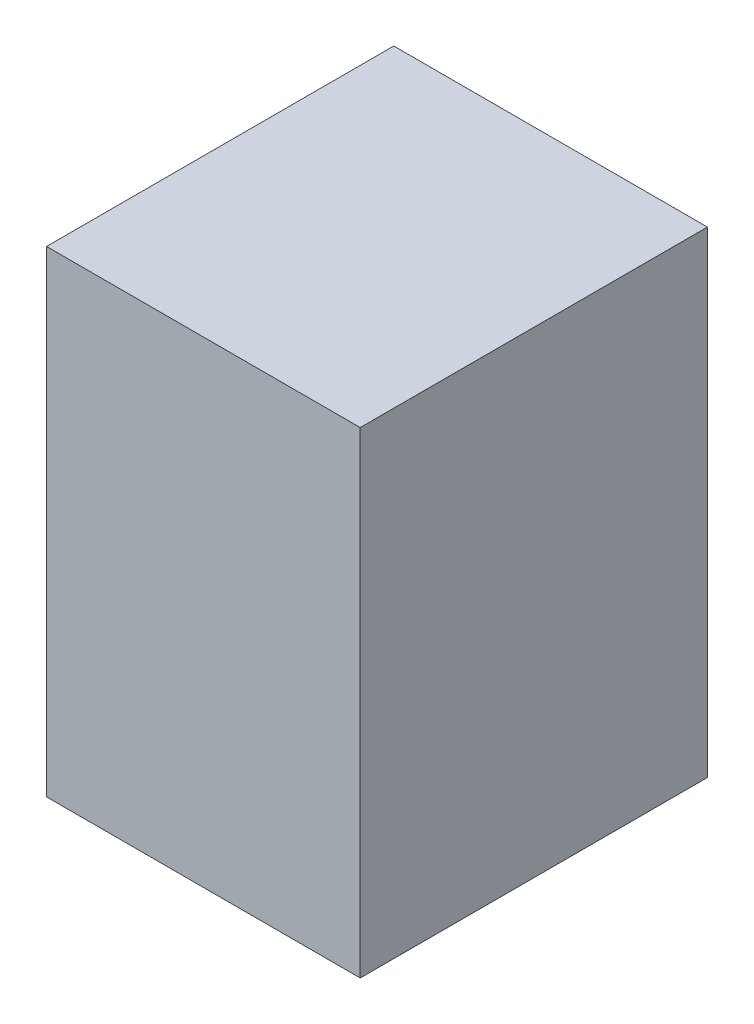
ISO-10303-21;
HEADER;
FILE_DESCRIPTION(('STEP AP214'),'2;1');
FILE_NAME('part.step','',(''),(''),'','','');
FILE_SCHEMA(('AUTOMOTIVE_DESIGN { 1 0 10303 214 1 1 1 1 }'));
ENDSEC;
DATA;
#1=APPLICATION_CONTEXT('core data for automotive mechanical design processes');
#2=APPLICATION_PROTOCOL_DEFINITION('international standard','automotive_design',2000,#1);
#3=PRODUCT_CONTEXT('',#1,'mechanical');
#4=PRODUCT('Part','Part','',(#3));
#5=PRODUCT_RELATED_PRODUCT_CATEGORY('part','',(#4));
#6=PRODUCT_DEFINITION_FORMATION('','',#4);
#7=PRODUCT_DEFINITION_CONTEXT('part definition',#1,'design');
#8=PRODUCT_DEFINITION('design','',#6,#7);
#9=PRODUCT_DEFINITION_SHAPE('','',#8);
#10=(LENGTH_UNIT() NAMED_UNIT(*) SI_UNIT(.MILLI.,.METRE.));
#11=(NAMED_UNIT(*) PLANE_ANGLE_UNIT() SI_UNIT($,.RADIAN.));
#12=(NAMED_UNIT(*) SI_UNIT($,.STERADIAN.) SOLID_ANGLE_UNIT());
#13=UNCERTAINTY_MEASURE_WITH_UNIT(LENGTH_MEASURE(1.E-05),#10,'distance_accuracy_value','');
#14=(GEOMETRIC_REPRESENTATION_CONTEXT(3) GLOBAL_UNCERTAINTY_ASSIGNED_CONTEXT((#13)) GLOBAL_UNIT_ASSIGNED_CONTEXT((#10,
#11,#12)) REPRESENTATION_CONTEXT('',''));
#15=CARTESIAN_POINT('',(0.,0.,0.));
#16=DIRECTION('',(0.,0.,1.));
#17=DIRECTION('',(1.,0.,0.));
#18=AXIS2_PLACEMENT_3D('',#15,#16,#17);
#19=CARTESIAN_POINT('',(20.1,30.55,44.5));
#20=DIRECTION('',(-1.,0.,0.));
#21=DIRECTION('',(0.,-1.,0.));
#22=AXIS2_PLACEMENT_3D('',#19,#20,#21);
#23=PLANE('',#22);
#24=DIRECTION('',(0.,1.,0.));
#25=VECTOR('',#24,1.);
#26=CARTESIAN_POINT('',(20.1,30.55,0.));
#27=LINE('',#26,#25);
#28=CARTESIAN_POINT('',(20.1,-30.55,0.));
#29=VERTEX_POINT('',#28);
#30=CARTESIAN_POINT('',(20.1,30.55,0.));
#31=VERTEX_POINT('',#30);
#32=EDGE_CURVE('E99',#29,#31,#27,.T.);
#33=ORIENTED_EDGE('',*,*,#32,.T.);
#34=DIRECTION('',(0.,0.,-1.));
#35=VECTOR('',#34,1.);
#36=CARTESIAN_POINT('',(20.1,30.55,44.5));
#37=LINE('',#36,#35);
#38=CARTESIAN_POINT('',(20.1,30.55,44.5));
#39=VERTEX_POINT('',#38);
#40=EDGE_CURVE('E11',#39,#31,#37,.T.);
#41=ORIENTED_EDGE('',*,*,#40,.F.);
#42=DIRECTION('',(0.,1.,0.));
#43=VECTOR('',#42,1.);
#44=CARTESIAN_POINT('',(20.1,30.55,44.5));
#45=LINE('',#44,#43);
#46=CARTESIAN_POINT('',(20.1,-30.55,44.5));
#47=VERTEX_POINT('',#46);
#48=EDGE_CURVE('E87',#47,#39,#45,.T.);
#49=ORIENTED_EDGE('',*,*,#48,.F.);
#50=DIRECTION('',(0.,0.,-1.));
#51=VECTOR('',#50,1.);
#52=CARTESIAN_POINT('',(20.1,-30.55,44.5));
#53=LINE('',#52,#51);
#54=EDGE_CURVE('E95',#47,#29,#53,.T.);
#55=ORIENTED_EDGE('',*,*,#54,.T.);
#56=EDGE_LOOP('',(#33,#41,#49,#55));
#57=FACE_BOUND('',#56,.T.);
#58=ADVANCED_FACE('F36',(#57),#23,.F.);
#59=CARTESIAN_POINT('',(-20.1,30.55,44.5));
#60=DIRECTION('',(0.,-1.,0.));
#61=DIRECTION('',(0.,0.,-1.));
#62=AXIS2_PLACEMENT_3D('',#59,#60,#61);
#63=PLANE('',#62);
#64=DIRECTION('',(-1.,0.,0.));
#65=VECTOR('',#64,1.);
#66=CARTESIAN_POINT('',(-20.1,30.55,0.));
#67=LINE('',#66,#65);
#68=CARTESIAN_POINT('',(-20.1,30.55,0.));
#69=VERTEX_POINT('',#68);
#70=EDGE_CURVE('E91',#31,#69,#67,.T.);
#71=ORIENTED_EDGE('',*,*,#70,.T.);
#72=DIRECTION('',(0.,0.,-1.));
#73=VECTOR('',#72,1.);
#74=CARTESIAN_POINT('',(-20.1,30.55,44.5));
#75=LINE('',#74,#73);
#76=CARTESIAN_POINT('',(-20.1,30.55,44.5));
#77=VERTEX_POINT('',#76);
#78=EDGE_CURVE('E44',#77,#69,#75,.T.);
#79=ORIENTED_EDGE('',*,*,#78,.F.);
#80=DIRECTION('',(-1.,0.,0.));
#81=VECTOR('',#80,1.);
#82=CARTESIAN_POINT('',(-20.1,30.55,44.5));
#83=LINE('',#82,#81);
#84=EDGE_CURVE('E82',#39,#77,#83,.T.);
#85=ORIENTED_EDGE('',*,*,#84,.F.);
#86=ORIENTED_EDGE('',*,*,#40,.T.);
#87=EDGE_LOOP('',(#71,#79,#85,#86));
#88=FACE_BOUND('',#87,.T.);
#89=ADVANCED_FACE('F90',(#88),#63,.F.);
#90=CARTESIAN_POINT('',(-20.1,30.55,44.5));
#91=DIRECTION('',(1.,0.,0.));
#92=DIRECTION('',(0.,1.,0.));
#93=AXIS2_PLACEMENT_3D('',#90,#91,#92);
#94=PLANE('',#93);
#95=DIRECTION('',(0.,-1.,0.));
#96=VECTOR('',#95,1.);
#97=CARTESIAN_POINT('',(-20.1,30.55,0.));
#98=LINE('',#97,#96);
#99=CARTESIAN_POINT('',(-20.1,-30.55,0.));
#100=VERTEX_POINT('',#99);
#101=EDGE_CURVE('E69',#69,#100,#98,.T.);
#102=ORIENTED_EDGE('',*,*,#101,.T.);
#103=DIRECTION('',(0.,0.,-1.));
#104=VECTOR('',#103,1.);
#105=CARTESIAN_POINT('',(-20.1,-30.55,44.5));
#106=LINE('',#105,#104);
#107=CARTESIAN_POINT('',(-20.1,-30.55,44.5));
#108=VERTEX_POINT('',#107);
#109=EDGE_CURVE('E92',#108,#100,#106,.T.);
#110=ORIENTED_EDGE('',*,*,#109,.F.);
#111=DIRECTION('',(0.,-1.,0.));
#112=VECTOR('',#111,1.);
#113=CARTESIAN_POINT('',(-20.1,30.55,44.5));
#114=LINE('',#113,#112);
#115=EDGE_CURVE('E85',#77,#108,#114,.T.);
#116=ORIENTED_EDGE('',*,*,#115,.F.);
#117=ORIENTED_EDGE('',*,*,#78,.T.);
#118=EDGE_LOOP('',(#102,#110,#116,#117));
#119=FACE_BOUND('',#118,.T.);
#120=ADVANCED_FACE('F93',(#119),#94,.F.);
#121=CARTESIAN_POINT('',(-20.1,-30.55,44.5));
#122=DIRECTION('',(0.,1.,0.));
#123=DIRECTION('',(0.,0.,1.));
#124=AXIS2_PLACEMENT_3D('',#121,#122,#123);
#125=PLANE('',#124);
#126=DIRECTION('',(1.,0.,0.));
#127=VECTOR('',#126,1.);
#128=CARTESIAN_POINT('',(-20.1,-30.55,0.));
#129=LINE('',#128,#127);
#130=EDGE_CURVE('E75',#100,#29,#129,.T.);
#131=ORIENTED_EDGE('',*,*,#130,.T.);
#132=ORIENTED_EDGE('',*,*,#54,.F.);
#133=DIRECTION('',(1.,0.,0.));
#134=VECTOR('',#133,1.);
#135=CARTESIAN_POINT('',(-20.1,-30.55,44.5));
#136=LINE('',#135,#134);
#137=EDGE_CURVE('E52',#108,#47,#136,.T.);
#138=ORIENTED_EDGE('',*,*,#137,.F.);
#139=ORIENTED_EDGE('',*,*,#109,.T.);
#140=EDGE_LOOP('',(#131,#132,#138,#139));
#141=FACE_BOUND('',#140,.T.);
#142=ADVANCED_FACE('F106',(#141),#125,.F.);
#143=CARTESIAN_POINT('',(0.,0.,44.5));
#144=DIRECTION('',(0.,0.,1.));
#145=DIRECTION('',(1.,0.,0.));
#146=AXIS2_PLACEMENT_3D('',#143,#144,#145);
#147=PLANE('',#146);
#148=ORIENTED_EDGE('',*,*,#48,.T.);
#149=ORIENTED_EDGE('',*,*,#84,.T.);
#150=ORIENTED_EDGE('',*,*,#115,.T.);
#151=ORIENTED_EDGE('',*,*,#137,.T.);
#152=EDGE_LOOP('',(#148,#149,#150,#151));
#153=FACE_BOUND('',#152,.T.);
#154=ADVANCED_FACE('F83',(#153),#147,.T.);
#155=CARTESIAN_POINT('',(0.,0.,0.));
#156=DIRECTION('',(0.,0.,1.));
#157=DIRECTION('',(1.,0.,0.));
#158=AXIS2_PLACEMENT_3D('',#155,#156,#157);
#159=PLANE('',#158);
#160=ORIENTED_EDGE('',*,*,#32,.F.);
#161=ORIENTED_EDGE('',*,*,#130,.F.);
#162=ORIENTED_EDGE('',*,*,#101,.F.);
#163=ORIENTED_EDGE('',*,*,#70,.F.);
#164=EDGE_LOOP('',(#160,#161,#162,#163));
#165=FACE_BOUND('',#164,.T.);
#166=ADVANCED_FACE('F109',(#165),#159,.F.);
#167=CLOSED_SHELL('',(#58,#89,#120,#142,#154,#166));
#168=MANIFOLD_SOLID_BREP('B2',#167);
#169=ADVANCED_BREP_SHAPE_REPRESENTATION('',(#18,#168),#14);
#170=SHAPE_DEFINITION_REPRESENTATION(#9,#169);
ENDSEC;
END-ISO-10303-21;
